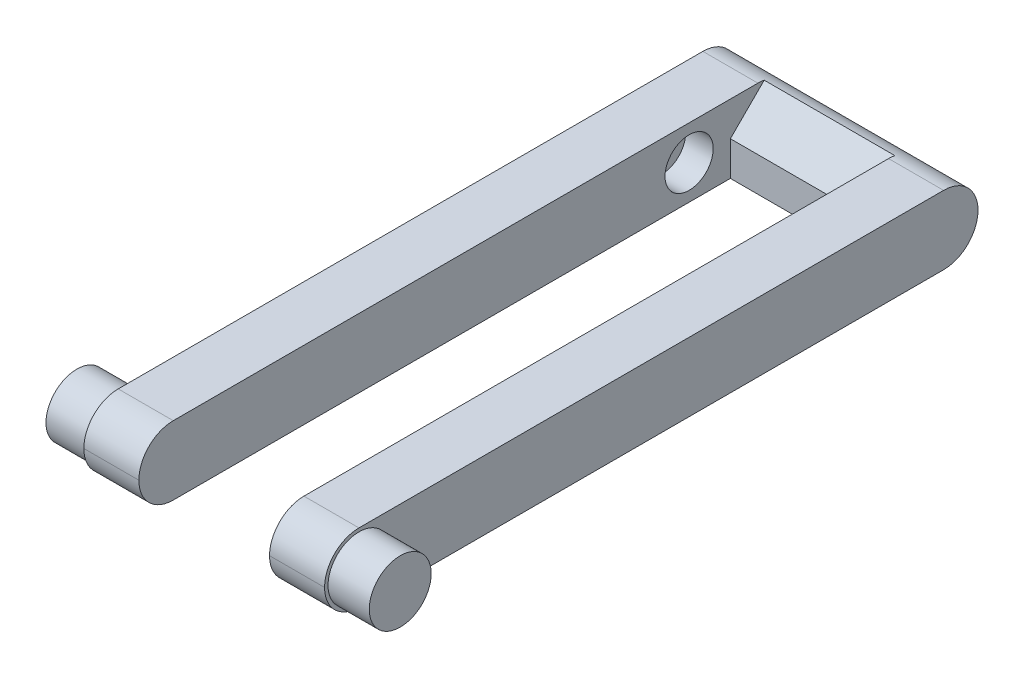
ISO-10303-21;
HEADER;
FILE_DESCRIPTION(('STEP AP214'),'2;1');
FILE_NAME('part.step','',(''),(''),'','','');
FILE_SCHEMA(('AUTOMOTIVE_DESIGN { 1 0 10303 214 1 1 1 1 }'));
ENDSEC;
DATA;
#1=APPLICATION_CONTEXT('core data for automotive mechanical design processes');
#2=APPLICATION_PROTOCOL_DEFINITION('international standard','automotive_design',2000,#1);
#3=PRODUCT_CONTEXT('',#1,'mechanical');
#4=PRODUCT('Part','Part','',(#3));
#5=PRODUCT_RELATED_PRODUCT_CATEGORY('part','',(#4));
#6=PRODUCT_DEFINITION_FORMATION('','',#4);
#7=PRODUCT_DEFINITION_CONTEXT('part definition',#1,'design');
#8=PRODUCT_DEFINITION('design','',#6,#7);
#9=PRODUCT_DEFINITION_SHAPE('','',#8);
#10=(LENGTH_UNIT() NAMED_UNIT(*) SI_UNIT(.MILLI.,.METRE.));
#11=(NAMED_UNIT(*) PLANE_ANGLE_UNIT() SI_UNIT($,.RADIAN.));
#12=(NAMED_UNIT(*) SI_UNIT($,.STERADIAN.) SOLID_ANGLE_UNIT());
#13=UNCERTAINTY_MEASURE_WITH_UNIT(LENGTH_MEASURE(1.E-05),#10,'distance_accuracy_value','');
#14=(GEOMETRIC_REPRESENTATION_CONTEXT(3) GLOBAL_UNCERTAINTY_ASSIGNED_CONTEXT((#13)) GLOBAL_UNIT_ASSIGNED_CONTEXT((#10,
#11,#12)) REPRESENTATION_CONTEXT('',''));
#15=CARTESIAN_POINT('',(0.,0.,0.));
#16=DIRECTION('',(0.,0.,1.));
#17=DIRECTION('',(1.,0.,0.));
#18=AXIS2_PLACEMENT_3D('',#15,#16,#17);
#19=CARTESIAN_POINT('',(0.,5.,0.));
#20=DIRECTION('',(0.,1.,0.));
#21=DIRECTION('',(0.,0.,1.));
#22=AXIS2_PLACEMENT_3D('',#19,#20,#21);
#23=PLANE('',#22);
#24=DIRECTION('',(0.,0.,1.));
#25=VECTOR('',#24,1.);
#26=CARTESIAN_POINT('',(17.5,5.,0.));
#27=LINE('',#26,#25);
#28=CARTESIAN_POINT('',(17.5,5.,2.5));
#29=VERTEX_POINT('',#28);
#30=CARTESIAN_POINT('',(17.5,5.,45.));
#31=VERTEX_POINT('',#30);
#32=EDGE_CURVE('E177',#29,#31,#27,.T.);
#33=ORIENTED_EDGE('',*,*,#32,.F.);
#34=DIRECTION('',(1.,0.,0.));
#35=VECTOR('',#34,1.);
#36=CARTESIAN_POINT('',(0.,5.,2.5));
#37=LINE('',#36,#35);
#38=CARTESIAN_POINT('',(13.5,5.,2.5));
#39=VERTEX_POINT('',#38);
#40=EDGE_CURVE('E263',#29,#39,#37,.F.);
#41=ORIENTED_EDGE('',*,*,#40,.T.);
#42=DIRECTION('',(0.,0.,-1.));
#43=VECTOR('',#42,1.);
#44=CARTESIAN_POINT('',(13.5,5.,0.));
#45=LINE('',#44,#43);
#46=CARTESIAN_POINT('',(13.5,5.,45.));
#47=VERTEX_POINT('',#46);
#48=EDGE_CURVE('E174',#47,#39,#45,.T.);
#49=ORIENTED_EDGE('',*,*,#48,.F.);
#50=DIRECTION('',(1.,0.,0.));
#51=VECTOR('',#50,1.);
#52=CARTESIAN_POINT('',(17.5,5.,45.));
#53=LINE('',#52,#51);
#54=EDGE_CURVE('E199',#47,#31,#53,.T.);
#55=ORIENTED_EDGE('',*,*,#54,.T.);
#56=EDGE_LOOP('',(#33,#41,#49,#55));
#57=FACE_BOUND('',#56,.T.);
#58=ADVANCED_FACE('F45',(#57),#23,.T.);
#59=CARTESIAN_POINT('',(0.,5.,2.));
#60=DIRECTION('',(0.,0.707106781186548,0.707106781186548));
#61=DIRECTION('',(-1.,0.,0.));
#62=AXIS2_PLACEMENT_3D('',#59,#60,#61);
#63=PLANE('',#62);
#64=DIRECTION('',(0.,-0.707106781186548,0.707106781186548));
#65=VECTOR('',#64,1.);
#66=CARTESIAN_POINT('',(13.5,5.,2.));
#67=LINE('',#66,#65);
#68=CARTESIAN_POINT('',(13.5,2.5,4.5));
#69=VERTEX_POINT('',#68);
#70=CARTESIAN_POINT('',(13.5,4.95773797371133,2.04226202628867));
#71=VERTEX_POINT('',#70);
#72=EDGE_CURVE('E241',#69,#71,#67,.F.);
#73=ORIENTED_EDGE('',*,*,#72,.T.);
#74=DIRECTION('',(1.,0.,0.));
#75=VECTOR('',#74,1.);
#76=CARTESIAN_POINT('',(13.5,4.95773797371133,2.04226202628867));
#77=LINE('',#76,#75);
#78=CARTESIAN_POINT('',(4.00000000000001,4.95773797371133,2.04226202628867));
#79=VERTEX_POINT('',#78);
#80=EDGE_CURVE('E55',#71,#79,#77,.F.);
#81=ORIENTED_EDGE('',*,*,#80,.T.);
#82=DIRECTION('',(0.,0.707106781186548,-0.707106781186548));
#83=VECTOR('',#82,1.);
#84=CARTESIAN_POINT('',(4.00000000000001,6.,1.));
#85=LINE('',#84,#83);
#86=CARTESIAN_POINT('',(4.00000000000001,2.5,4.5));
#87=VERTEX_POINT('',#86);
#88=EDGE_CURVE('E238',#79,#87,#85,.F.);
#89=ORIENTED_EDGE('',*,*,#88,.T.);
#90=DIRECTION('',(-1.,0.,0.));
#91=VECTOR('',#90,1.);
#92=CARTESIAN_POINT('',(0.,2.5,4.5));
#93=LINE('',#92,#91);
#94=EDGE_CURVE('E150',#69,#87,#93,.T.);
#95=ORIENTED_EDGE('',*,*,#94,.F.);
#96=EDGE_LOOP('',(#73,#81,#89,#95));
#97=FACE_BOUND('',#96,.T.);
#98=ADVANCED_FACE('F341',(#97),#63,.T.);
#99=CARTESIAN_POINT('',(13.5,5.,0.));
#100=DIRECTION('',(-1.,0.,0.));
#101=DIRECTION('',(0.,0.,1.));
#102=AXIS2_PLACEMENT_3D('',#99,#100,#101);
#103=PLANE('',#102);
#104=CARTESIAN_POINT('',(13.5,2.5,7.5));
#105=DIRECTION('',(-1.,0.,0.));
#106=DIRECTION('',(0.,0.,1.));
#107=AXIS2_PLACEMENT_3D('',#104,#105,#106);
#108=CIRCLE('',#107,1.75);
#109=CARTESIAN_POINT('',(13.5,2.5,9.25));
#110=VERTEX_POINT('',#109);
#111=EDGE_CURVE('E271',#110,#110,#108,.F.);
#112=ORIENTED_EDGE('',*,*,#111,.T.);
#113=EDGE_LOOP('',(#112));
#114=FACE_BOUND('',#113,.T.);
#115=ORIENTED_EDGE('',*,*,#48,.T.);
#116=CARTESIAN_POINT('',(13.5,2.5,2.5));
#117=DIRECTION('',(-1.,0.,0.));
#118=DIRECTION('',(0.,0.,1.));
#119=AXIS2_PLACEMENT_3D('',#116,#117,#118);
#120=CIRCLE('',#119,2.5);
#121=EDGE_CURVE('E70',#39,#71,#120,.T.);
#122=ORIENTED_EDGE('',*,*,#121,.T.);
#123=ORIENTED_EDGE('',*,*,#72,.F.);
#124=DIRECTION('',(0.,-1.,0.));
#125=VECTOR('',#124,1.);
#126=CARTESIAN_POINT('',(13.5,5.,4.5));
#127=LINE('',#126,#125);
#128=CARTESIAN_POINT('',(13.5,0.,4.5));
#129=VERTEX_POINT('',#128);
#130=EDGE_CURVE('E154',#69,#129,#127,.T.);
#131=ORIENTED_EDGE('',*,*,#130,.T.);
#132=DIRECTION('',(0.,0.,-1.));
#133=VECTOR('',#132,1.);
#134=CARTESIAN_POINT('',(13.5,0.,0.));
#135=LINE('',#134,#133);
#136=CARTESIAN_POINT('',(13.5,0.,45.));
#137=VERTEX_POINT('',#136);
#138=EDGE_CURVE('E172',#137,#129,#135,.T.);
#139=ORIENTED_EDGE('',*,*,#138,.F.);
#140=CARTESIAN_POINT('',(13.5,2.5,45.));
#141=DIRECTION('',(-1.,0.,0.));
#142=DIRECTION('',(0.,0.,1.));
#143=AXIS2_PLACEMENT_3D('',#140,#141,#142);
#144=CIRCLE('',#143,2.5);
#145=CARTESIAN_POINT('',(13.5,2.5,47.5));
#146=VERTEX_POINT('',#145);
#147=EDGE_CURVE('E196',#137,#146,#144,.T.);
#148=ORIENTED_EDGE('',*,*,#147,.T.);
#149=CARTESIAN_POINT('',(13.5,2.5,45.));
#150=DIRECTION('',(-1.,0.,0.));
#151=DIRECTION('',(0.,0.,1.));
#152=AXIS2_PLACEMENT_3D('',#149,#150,#151);
#153=CIRCLE('',#152,2.5);
#154=EDGE_CURVE('E193',#146,#47,#153,.T.);
#155=ORIENTED_EDGE('',*,*,#154,.T.);
#156=EDGE_LOOP('',(#115,#122,#123,#131,#139,#148,#155));
#157=FACE_BOUND('',#156,.T.);
#158=ADVANCED_FACE('F339',(#114,#157),#103,.T.);
#159=CARTESIAN_POINT('',(17.5,5.,0.));
#160=DIRECTION('',(1.,0.,0.));
#161=DIRECTION('',(0.,0.,-1.));
#162=AXIS2_PLACEMENT_3D('',#159,#160,#161);
#163=PLANE('',#162);
#164=CARTESIAN_POINT('',(17.5,2.5,45.));
#165=DIRECTION('',(1.,0.,0.));
#166=DIRECTION('',(0.,0.,-1.));
#167=AXIS2_PLACEMENT_3D('',#164,#165,#166);
#168=CIRCLE('',#167,2.25);
#169=CARTESIAN_POINT('',(17.5,2.5,42.75));
#170=VERTEX_POINT('',#169);
#171=EDGE_CURVE('E208',#170,#170,#168,.T.);
#172=ORIENTED_EDGE('',*,*,#171,.F.);
#173=EDGE_LOOP('',(#172));
#174=FACE_BOUND('',#173,.T.);
#175=DIRECTION('',(0.,0.,1.));
#176=VECTOR('',#175,1.);
#177=CARTESIAN_POINT('',(17.5,0.,0.));
#178=LINE('',#177,#176);
#179=CARTESIAN_POINT('',(17.5,0.,2.5));
#180=VERTEX_POINT('',#179);
#181=CARTESIAN_POINT('',(17.5,0.,45.));
#182=VERTEX_POINT('',#181);
#183=EDGE_CURVE('E306',#180,#182,#178,.T.);
#184=ORIENTED_EDGE('',*,*,#183,.F.);
#185=CARTESIAN_POINT('',(17.5,2.5,2.5));
#186=DIRECTION('',(1.,0.,0.));
#187=DIRECTION('',(0.,0.,-1.));
#188=AXIS2_PLACEMENT_3D('',#185,#186,#187);
#189=CIRCLE('',#188,2.5);
#190=CARTESIAN_POINT('',(17.5,2.5,0.));
#191=VERTEX_POINT('',#190);
#192=EDGE_CURVE('E251',#180,#191,#189,.T.);
#193=ORIENTED_EDGE('',*,*,#192,.T.);
#194=CARTESIAN_POINT('',(17.5,2.5,2.5));
#195=DIRECTION('',(1.,0.,0.));
#196=DIRECTION('',(0.,0.,-1.));
#197=AXIS2_PLACEMENT_3D('',#194,#195,#196);
#198=CIRCLE('',#197,2.5);
#199=EDGE_CURVE('E248',#191,#29,#198,.T.);
#200=ORIENTED_EDGE('',*,*,#199,.T.);
#201=ORIENTED_EDGE('',*,*,#32,.T.);
#202=CARTESIAN_POINT('',(17.5,2.5,45.));
#203=DIRECTION('',(1.,0.,0.));
#204=DIRECTION('',(0.,0.,-1.));
#205=AXIS2_PLACEMENT_3D('',#202,#203,#204);
#206=CIRCLE('',#205,2.5);
#207=CARTESIAN_POINT('',(17.5,2.5,47.5));
#208=VERTEX_POINT('',#207);
#209=EDGE_CURVE('E153',#31,#208,#206,.T.);
#210=ORIENTED_EDGE('',*,*,#209,.T.);
#211=CARTESIAN_POINT('',(17.5,2.5,45.));
#212=DIRECTION('',(1.,0.,0.));
#213=DIRECTION('',(0.,0.,-1.));
#214=AXIS2_PLACEMENT_3D('',#211,#212,#213);
#215=CIRCLE('',#214,2.5);
#216=EDGE_CURVE('E186',#208,#182,#215,.T.);
#217=ORIENTED_EDGE('',*,*,#216,.T.);
#218=EDGE_LOOP('',(#184,#193,#200,#201,#210,#217));
#219=FACE_BOUND('',#218,.T.);
#220=ADVANCED_FACE('F332',(#174,#219),#163,.T.);
#221=CARTESIAN_POINT('',(0.,5.,0.));
#222=DIRECTION('',(1.,0.,0.));
#223=DIRECTION('',(0.,0.,-1.));
#224=AXIS2_PLACEMENT_3D('',#221,#222,#223);
#225=PLANE('',#224);
#226=CARTESIAN_POINT('',(0.,2.5,45.));
#227=DIRECTION('',(1.,0.,0.));
#228=DIRECTION('',(0.,0.,-1.));
#229=AXIS2_PLACEMENT_3D('',#226,#227,#228);
#230=CIRCLE('',#229,2.25);
#231=CARTESIAN_POINT('',(0.,2.5,42.75));
#232=VERTEX_POINT('',#231);
#233=EDGE_CURVE('E203',#232,#232,#230,.F.);
#234=ORIENTED_EDGE('',*,*,#233,.F.);
#235=EDGE_LOOP('',(#234));
#236=FACE_BOUND('',#235,.T.);
#237=CARTESIAN_POINT('',(0.,2.5,2.5));
#238=DIRECTION('',(1.,0.,0.));
#239=DIRECTION('',(0.,0.,-1.));
#240=AXIS2_PLACEMENT_3D('',#237,#238,#239);
#241=CIRCLE('',#240,2.5);
#242=CARTESIAN_POINT('',(0.,5.,2.5));
#243=VERTEX_POINT('',#242);
#244=CARTESIAN_POINT('',(0.,2.5,0.));
#245=VERTEX_POINT('',#244);
#246=EDGE_CURVE('E254',#243,#245,#241,.F.);
#247=ORIENTED_EDGE('',*,*,#246,.T.);
#248=CARTESIAN_POINT('',(0.,2.5,2.5));
#249=DIRECTION('',(1.,0.,0.));
#250=DIRECTION('',(0.,0.,-1.));
#251=AXIS2_PLACEMENT_3D('',#248,#249,#250);
#252=CIRCLE('',#251,2.5);
#253=CARTESIAN_POINT('',(0.,0.,2.5));
#254=VERTEX_POINT('',#253);
#255=EDGE_CURVE('E257',#245,#254,#252,.F.);
#256=ORIENTED_EDGE('',*,*,#255,.T.);
#257=DIRECTION('',(0.,0.,1.));
#258=VECTOR('',#257,1.);
#259=CARTESIAN_POINT('',(0.,0.,0.));
#260=LINE('',#259,#258);
#261=CARTESIAN_POINT('',(0.,0.,45.));
#262=VERTEX_POINT('',#261);
#263=EDGE_CURVE('E165',#254,#262,#260,.T.);
#264=ORIENTED_EDGE('',*,*,#263,.T.);
#265=CARTESIAN_POINT('',(0.,2.5,45.));
#266=DIRECTION('',(1.,0.,0.));
#267=DIRECTION('',(0.,0.,-1.));
#268=AXIS2_PLACEMENT_3D('',#265,#266,#267);
#269=CIRCLE('',#268,2.5);
#270=CARTESIAN_POINT('',(0.,2.5,47.5));
#271=VERTEX_POINT('',#270);
#272=EDGE_CURVE('E225',#262,#271,#269,.F.);
#273=ORIENTED_EDGE('',*,*,#272,.T.);
#274=CARTESIAN_POINT('',(0.,2.5,45.));
#275=DIRECTION('',(1.,0.,0.));
#276=DIRECTION('',(0.,0.,-1.));
#277=AXIS2_PLACEMENT_3D('',#274,#275,#276);
#278=CIRCLE('',#277,2.5);
#279=CARTESIAN_POINT('',(0.,5.,45.));
#280=VERTEX_POINT('',#279);
#281=EDGE_CURVE('E221',#271,#280,#278,.F.);
#282=ORIENTED_EDGE('',*,*,#281,.T.);
#283=DIRECTION('',(0.,0.,1.));
#284=VECTOR('',#283,1.);
#285=CARTESIAN_POINT('',(0.,5.,0.));
#286=LINE('',#285,#284);
#287=EDGE_CURVE('E298',#243,#280,#286,.T.);
#288=ORIENTED_EDGE('',*,*,#287,.F.);
#289=EDGE_LOOP('',(#247,#256,#264,#273,#282,#288));
#290=FACE_BOUND('',#289,.T.);
#291=ADVANCED_FACE('F311',(#236,#290),#225,.F.);
#292=CARTESIAN_POINT('',(4.00000000000001,5.,0.));
#293=DIRECTION('',(-1.,0.,0.));
#294=DIRECTION('',(0.,0.,1.));
#295=AXIS2_PLACEMENT_3D('',#292,#293,#294);
#296=PLANE('',#295);
#297=CARTESIAN_POINT('',(4.00000000000001,2.5,7.5));
#298=DIRECTION('',(-1.,0.,0.));
#299=DIRECTION('',(0.,0.,1.));
#300=AXIS2_PLACEMENT_3D('',#297,#298,#299);
#301=CIRCLE('',#300,1.75);
#302=CARTESIAN_POINT('',(4.00000000000001,2.5,9.25));
#303=VERTEX_POINT('',#302);
#304=EDGE_CURVE('E49',#303,#303,#301,.F.);
#305=ORIENTED_EDGE('',*,*,#304,.F.);
#306=EDGE_LOOP('',(#305));
#307=FACE_BOUND('',#306,.T.);
#308=ORIENTED_EDGE('',*,*,#88,.F.);
#309=CARTESIAN_POINT('',(4.00000000000001,2.5,2.5));
#310=DIRECTION('',(-1.,0.,0.));
#311=DIRECTION('',(0.,0.,1.));
#312=AXIS2_PLACEMENT_3D('',#309,#310,#311);
#313=CIRCLE('',#312,2.5);
#314=CARTESIAN_POINT('',(4.00000000000001,5.,2.5));
#315=VERTEX_POINT('',#314);
#316=EDGE_CURVE('E13',#79,#315,#313,.F.);
#317=ORIENTED_EDGE('',*,*,#316,.T.);
#318=DIRECTION('',(0.,0.,-1.));
#319=VECTOR('',#318,1.);
#320=CARTESIAN_POINT('',(4.00000000000001,5.,0.));
#321=LINE('',#320,#319);
#322=CARTESIAN_POINT('',(4.00000000000001,5.,45.));
#323=VERTEX_POINT('',#322);
#324=EDGE_CURVE('E182',#323,#315,#321,.T.);
#325=ORIENTED_EDGE('',*,*,#324,.F.);
#326=CARTESIAN_POINT('',(4.00000000000001,2.5,45.));
#327=DIRECTION('',(-1.,0.,0.));
#328=DIRECTION('',(0.,0.,1.));
#329=AXIS2_PLACEMENT_3D('',#326,#327,#328);
#330=CIRCLE('',#329,2.5);
#331=CARTESIAN_POINT('',(4.00000000000001,2.5,47.5));
#332=VERTEX_POINT('',#331);
#333=EDGE_CURVE('E213',#323,#332,#330,.F.);
#334=ORIENTED_EDGE('',*,*,#333,.T.);
#335=CARTESIAN_POINT('',(4.00000000000001,2.5,45.));
#336=DIRECTION('',(-1.,0.,0.));
#337=DIRECTION('',(0.,0.,1.));
#338=AXIS2_PLACEMENT_3D('',#335,#336,#337);
#339=CIRCLE('',#338,2.5);
#340=CARTESIAN_POINT('',(4.00000000000001,0.,45.));
#341=VERTEX_POINT('',#340);
#342=EDGE_CURVE('E160',#332,#341,#339,.F.);
#343=ORIENTED_EDGE('',*,*,#342,.T.);
#344=DIRECTION('',(0.,0.,-1.));
#345=VECTOR('',#344,1.);
#346=CARTESIAN_POINT('',(4.00000000000001,0.,0.));
#347=LINE('',#346,#345);
#348=CARTESIAN_POINT('',(4.00000000000001,0.,4.5));
#349=VERTEX_POINT('',#348);
#350=EDGE_CURVE('E157',#341,#349,#347,.T.);
#351=ORIENTED_EDGE('',*,*,#350,.T.);
#352=DIRECTION('',(0.,-1.,0.));
#353=VECTOR('',#352,1.);
#354=CARTESIAN_POINT('',(4.00000000000001,5.,4.5));
#355=LINE('',#354,#353);
#356=EDGE_CURVE('E143',#87,#349,#355,.T.);
#357=ORIENTED_EDGE('',*,*,#356,.F.);
#358=EDGE_LOOP('',(#308,#317,#325,#334,#343,#351,#357));
#359=FACE_BOUND('',#358,.T.);
#360=ADVANCED_FACE('F158',(#307,#359),#296,.F.);
#361=CARTESIAN_POINT('',(0.,5.,4.5));
#362=DIRECTION('',(0.,0.,-1.));
#363=DIRECTION('',(-1.,0.,0.));
#364=AXIS2_PLACEMENT_3D('',#361,#362,#363);
#365=PLANE('',#364);
#366=ORIENTED_EDGE('',*,*,#130,.F.);
#367=ORIENTED_EDGE('',*,*,#94,.T.);
#368=ORIENTED_EDGE('',*,*,#356,.T.);
#369=DIRECTION('',(1.,0.,0.));
#370=VECTOR('',#369,1.);
#371=CARTESIAN_POINT('',(0.,0.,4.5));
#372=LINE('',#371,#370);
#373=EDGE_CURVE('E148',#349,#129,#372,.T.);
#374=ORIENTED_EDGE('',*,*,#373,.T.);
#375=EDGE_LOOP('',(#366,#367,#368,#374));
#376=FACE_BOUND('',#375,.T.);
#377=ADVANCED_FACE('F146',(#376),#365,.F.);
#378=ORIENTED_EDGE('',*,*,#324,.T.);
#379=DIRECTION('',(1.,0.,0.));
#380=VECTOR('',#379,1.);
#381=CARTESIAN_POINT('',(0.,5.,2.5));
#382=LINE('',#381,#380);
#383=EDGE_CURVE('E260',#315,#243,#382,.F.);
#384=ORIENTED_EDGE('',*,*,#383,.T.);
#385=ORIENTED_EDGE('',*,*,#287,.T.);
#386=DIRECTION('',(1.,0.,0.));
#387=VECTOR('',#386,1.);
#388=CARTESIAN_POINT('',(4.00000000000001,5.,45.));
#389=LINE('',#388,#387);
#390=EDGE_CURVE('E228',#280,#323,#389,.T.);
#391=ORIENTED_EDGE('',*,*,#390,.T.);
#392=EDGE_LOOP('',(#378,#384,#385,#391));
#393=FACE_BOUND('',#392,.T.);
#394=ADVANCED_FACE('F364',(#393),#23,.T.);
#395=CARTESIAN_POINT('',(0.,0.,0.));
#396=DIRECTION('',(0.,1.,0.));
#397=DIRECTION('',(0.,0.,1.));
#398=AXIS2_PLACEMENT_3D('',#395,#396,#397);
#399=PLANE('',#398);
#400=ORIENTED_EDGE('',*,*,#263,.F.);
#401=DIRECTION('',(1.,0.,0.));
#402=VECTOR('',#401,1.);
#403=CARTESIAN_POINT('',(17.5,0.,2.5));
#404=LINE('',#403,#402);
#405=EDGE_CURVE('E244',#254,#180,#404,.T.);
#406=ORIENTED_EDGE('',*,*,#405,.T.);
#407=ORIENTED_EDGE('',*,*,#183,.T.);
#408=DIRECTION('',(1.,0.,0.));
#409=VECTOR('',#408,1.);
#410=CARTESIAN_POINT('',(0.,0.,45.));
#411=LINE('',#410,#409);
#412=EDGE_CURVE('E190',#182,#137,#411,.F.);
#413=ORIENTED_EDGE('',*,*,#412,.T.);
#414=ORIENTED_EDGE('',*,*,#138,.T.);
#415=ORIENTED_EDGE('',*,*,#373,.F.);
#416=ORIENTED_EDGE('',*,*,#350,.F.);
#417=DIRECTION('',(1.,0.,0.));
#418=VECTOR('',#417,1.);
#419=CARTESIAN_POINT('',(0.,0.,45.));
#420=LINE('',#419,#418);
#421=EDGE_CURVE('E218',#341,#262,#420,.F.);
#422=ORIENTED_EDGE('',*,*,#421,.T.);
#423=EDGE_LOOP('',(#400,#406,#407,#413,#414,#415,#416,#422));
#424=FACE_BOUND('',#423,.T.);
#425=ADVANCED_FACE('F169',(#424),#399,.F.);
#426=CARTESIAN_POINT('',(20.5,2.5,45.));
#427=DIRECTION('',(-1.,0.,0.));
#428=DIRECTION('',(0.,0.,1.));
#429=AXIS2_PLACEMENT_3D('',#426,#427,#428);
#430=CYLINDRICAL_SURFACE('',#429,2.25);
#431=CARTESIAN_POINT('',(20.5,2.5,45.));
#432=DIRECTION('',(1.,0.,0.));
#433=DIRECTION('',(0.,0.,-1.));
#434=AXIS2_PLACEMENT_3D('',#431,#432,#433);
#435=CIRCLE('',#434,2.25);
#436=CARTESIAN_POINT('',(20.5,2.5,42.75));
#437=VERTEX_POINT('',#436);
#438=EDGE_CURVE('E289',#437,#437,#435,.T.);
#439=ORIENTED_EDGE('',*,*,#438,.F.);
#440=EDGE_LOOP('',(#439));
#441=FACE_BOUND('',#440,.T.);
#442=ORIENTED_EDGE('',*,*,#171,.T.);
#443=EDGE_LOOP('',(#442));
#444=FACE_BOUND('',#443,.T.);
#445=ADVANCED_FACE('F358',(#441,#444),#430,.T.);
#446=CARTESIAN_POINT('',(20.5,2.5,45.));
#447=DIRECTION('',(1.,0.,0.));
#448=DIRECTION('',(0.,0.,-1.));
#449=AXIS2_PLACEMENT_3D('',#446,#447,#448);
#450=PLANE('',#449);
#451=ORIENTED_EDGE('',*,*,#438,.T.);
#452=EDGE_LOOP('',(#451));
#453=FACE_BOUND('',#452,.T.);
#454=ADVANCED_FACE('F350',(#453),#450,.T.);
#455=CARTESIAN_POINT('',(0.,2.5,45.));
#456=DIRECTION('',(-1.,0.,0.));
#457=DIRECTION('',(0.,0.,1.));
#458=AXIS2_PLACEMENT_3D('',#455,#456,#457);
#459=CYLINDRICAL_SURFACE('',#458,2.5);
#460=ORIENTED_EDGE('',*,*,#54,.F.);
#461=ORIENTED_EDGE('',*,*,#154,.F.);
#462=DIRECTION('',(1.,0.,0.));
#463=VECTOR('',#462,1.);
#464=CARTESIAN_POINT('',(13.5,2.5,47.5));
#465=LINE('',#464,#463);
#466=EDGE_CURVE('E204',#208,#146,#465,.F.);
#467=ORIENTED_EDGE('',*,*,#466,.F.);
#468=ORIENTED_EDGE('',*,*,#209,.F.);
#469=EDGE_LOOP('',(#460,#461,#467,#468));
#470=FACE_BOUND('',#469,.T.);
#471=ADVANCED_FACE('F348',(#470),#459,.T.);
#472=CARTESIAN_POINT('',(0.,2.5,45.));
#473=DIRECTION('',(1.,0.,0.));
#474=DIRECTION('',(0.,0.,-1.));
#475=AXIS2_PLACEMENT_3D('',#472,#473,#474);
#476=CYLINDRICAL_SURFACE('',#475,2.5);
#477=ORIENTED_EDGE('',*,*,#147,.F.);
#478=ORIENTED_EDGE('',*,*,#412,.F.);
#479=ORIENTED_EDGE('',*,*,#216,.F.);
#480=ORIENTED_EDGE('',*,*,#466,.T.);
#481=EDGE_LOOP('',(#477,#478,#479,#480));
#482=FACE_BOUND('',#481,.T.);
#483=ADVANCED_FACE('F338',(#482),#476,.T.);
#484=CARTESIAN_POINT('',(-2.99999999999999,2.5,45.));
#485=DIRECTION('',(1.,0.,0.));
#486=DIRECTION('',(0.,0.,-1.));
#487=AXIS2_PLACEMENT_3D('',#484,#485,#486);
#488=CYLINDRICAL_SURFACE('',#487,2.25);
#489=CARTESIAN_POINT('',(-2.99999999999999,2.5,45.));
#490=DIRECTION('',(-1.,0.,0.));
#491=DIRECTION('',(0.,0.,1.));
#492=AXIS2_PLACEMENT_3D('',#489,#490,#491);
#493=CIRCLE('',#492,2.25);
#494=CARTESIAN_POINT('',(-2.99999999999999,2.5,47.25));
#495=VERTEX_POINT('',#494);
#496=EDGE_CURVE('E209',#495,#495,#493,.T.);
#497=ORIENTED_EDGE('',*,*,#496,.F.);
#498=EDGE_LOOP('',(#497));
#499=FACE_BOUND('',#498,.T.);
#500=ORIENTED_EDGE('',*,*,#233,.T.);
#501=EDGE_LOOP('',(#500));
#502=FACE_BOUND('',#501,.T.);
#503=ADVANCED_FACE('F356',(#499,#502),#488,.T.);
#504=CARTESIAN_POINT('',(-2.99999999999999,2.5,45.));
#505=DIRECTION('',(-1.,0.,0.));
#506=DIRECTION('',(0.,0.,1.));
#507=AXIS2_PLACEMENT_3D('',#504,#505,#506);
#508=PLANE('',#507);
#509=ORIENTED_EDGE('',*,*,#496,.T.);
#510=EDGE_LOOP('',(#509));
#511=FACE_BOUND('',#510,.T.);
#512=ADVANCED_FACE('F455',(#511),#508,.T.);
#513=CARTESIAN_POINT('',(0.,2.5,45.));
#514=DIRECTION('',(-1.,0.,0.));
#515=DIRECTION('',(0.,0.,1.));
#516=AXIS2_PLACEMENT_3D('',#513,#514,#515);
#517=CYLINDRICAL_SURFACE('',#516,2.5);
#518=ORIENTED_EDGE('',*,*,#390,.F.);
#519=ORIENTED_EDGE('',*,*,#281,.F.);
#520=DIRECTION('',(1.,0.,0.));
#521=VECTOR('',#520,1.);
#522=CARTESIAN_POINT('',(0.,2.5,47.5));
#523=LINE('',#522,#521);
#524=EDGE_CURVE('E231',#332,#271,#523,.F.);
#525=ORIENTED_EDGE('',*,*,#524,.F.);
#526=ORIENTED_EDGE('',*,*,#333,.F.);
#527=EDGE_LOOP('',(#518,#519,#525,#526));
#528=FACE_BOUND('',#527,.T.);
#529=ADVANCED_FACE('F320',(#528),#517,.T.);
#530=CARTESIAN_POINT('',(0.,2.5,45.));
#531=DIRECTION('',(1.,0.,0.));
#532=DIRECTION('',(0.,0.,-1.));
#533=AXIS2_PLACEMENT_3D('',#530,#531,#532);
#534=CYLINDRICAL_SURFACE('',#533,2.5);
#535=ORIENTED_EDGE('',*,*,#272,.F.);
#536=ORIENTED_EDGE('',*,*,#421,.F.);
#537=ORIENTED_EDGE('',*,*,#342,.F.);
#538=ORIENTED_EDGE('',*,*,#524,.T.);
#539=EDGE_LOOP('',(#535,#536,#537,#538));
#540=FACE_BOUND('',#539,.T.);
#541=ADVANCED_FACE('F315',(#540),#534,.T.);
#542=CARTESIAN_POINT('',(0.,2.5,2.5));
#543=DIRECTION('',(1.,0.,0.));
#544=DIRECTION('',(0.,0.,-1.));
#545=AXIS2_PLACEMENT_3D('',#542,#543,#544);
#546=CYLINDRICAL_SURFACE('',#545,2.5);
#547=DIRECTION('',(1.,0.,0.));
#548=VECTOR('',#547,1.);
#549=CARTESIAN_POINT('',(0.,2.5,0.));
#550=LINE('',#549,#548);
#551=EDGE_CURVE('E235',#245,#191,#550,.T.);
#552=ORIENTED_EDGE('',*,*,#551,.F.);
#553=ORIENTED_EDGE('',*,*,#246,.F.);
#554=ORIENTED_EDGE('',*,*,#383,.F.);
#555=ORIENTED_EDGE('',*,*,#316,.F.);
#556=ORIENTED_EDGE('',*,*,#80,.F.);
#557=ORIENTED_EDGE('',*,*,#121,.F.);
#558=ORIENTED_EDGE('',*,*,#40,.F.);
#559=ORIENTED_EDGE('',*,*,#199,.F.);
#560=EDGE_LOOP('',(#552,#553,#554,#555,#556,#557,#558,#559));
#561=FACE_BOUND('',#560,.T.);
#562=ADVANCED_FACE('F47',(#561),#546,.T.);
#563=CARTESIAN_POINT('',(0.,2.5,2.5));
#564=DIRECTION('',(-1.,0.,0.));
#565=DIRECTION('',(0.,0.,1.));
#566=AXIS2_PLACEMENT_3D('',#563,#564,#565);
#567=CYLINDRICAL_SURFACE('',#566,2.5);
#568=ORIENTED_EDGE('',*,*,#255,.F.);
#569=ORIENTED_EDGE('',*,*,#551,.T.);
#570=ORIENTED_EDGE('',*,*,#192,.F.);
#571=ORIENTED_EDGE('',*,*,#405,.F.);
#572=EDGE_LOOP('',(#568,#569,#570,#571));
#573=FACE_BOUND('',#572,.T.);
#574=ADVANCED_FACE('F329',(#573),#567,.T.);
#575=CARTESIAN_POINT('',(2.00000000000001,2.5,7.5));
#576=DIRECTION('',(-1.,0.,0.));
#577=DIRECTION('',(0.,0.,1.));
#578=AXIS2_PLACEMENT_3D('',#575,#576,#577);
#579=PLANE('',#578);
#580=CARTESIAN_POINT('',(2.00000000000001,2.5,7.5));
#581=DIRECTION('',(-1.,0.,0.));
#582=DIRECTION('',(0.,0.,1.));
#583=AXIS2_PLACEMENT_3D('',#580,#581,#582);
#584=CIRCLE('',#583,1.75);
#585=CARTESIAN_POINT('',(2.00000000000001,2.5,9.25));
#586=VERTEX_POINT('',#585);
#587=EDGE_CURVE('E282',#586,#586,#584,.T.);
#588=ORIENTED_EDGE('',*,*,#587,.F.);
#589=EDGE_LOOP('',(#588));
#590=FACE_BOUND('',#589,.T.);
#591=ADVANCED_FACE('F413',(#590),#579,.F.);
#592=CARTESIAN_POINT('',(2.00000000000001,2.5,7.5));
#593=DIRECTION('',(1.,0.,0.));
#594=DIRECTION('',(0.,0.,-1.));
#595=AXIS2_PLACEMENT_3D('',#592,#593,#594);
#596=CYLINDRICAL_SURFACE('',#595,1.75);
#597=ORIENTED_EDGE('',*,*,#587,.T.);
#598=EDGE_LOOP('',(#597));
#599=FACE_BOUND('',#598,.T.);
#600=ORIENTED_EDGE('',*,*,#304,.T.);
#601=EDGE_LOOP('',(#600));
#602=FACE_BOUND('',#601,.T.);
#603=ADVANCED_FACE('F418',(#599,#602),#596,.F.);
#604=ORIENTED_EDGE('',*,*,#111,.F.);
#605=EDGE_LOOP('',(#604));
#606=FACE_BOUND('',#605,.T.);
#607=CARTESIAN_POINT('',(15.5,2.5,7.5));
#608=DIRECTION('',(-1.,0.,0.));
#609=DIRECTION('',(0.,0.,1.));
#610=AXIS2_PLACEMENT_3D('',#607,#608,#609);
#611=CIRCLE('',#610,1.75);
#612=CARTESIAN_POINT('',(15.5,2.5,9.25));
#613=VERTEX_POINT('',#612);
#614=EDGE_CURVE('E551',#613,#613,#611,.T.);
#615=ORIENTED_EDGE('',*,*,#614,.F.);
#616=EDGE_LOOP('',(#615));
#617=FACE_BOUND('',#616,.T.);
#618=ADVANCED_FACE('F430',(#606,#617),#596,.F.);
#619=CARTESIAN_POINT('',(15.5,2.5,7.5));
#620=DIRECTION('',(-1.,0.,0.));
#621=DIRECTION('',(0.,0.,1.));
#622=AXIS2_PLACEMENT_3D('',#619,#620,#621);
#623=PLANE('',#622);
#624=ORIENTED_EDGE('',*,*,#614,.T.);
#625=EDGE_LOOP('',(#624));
#626=FACE_BOUND('',#625,.T.);
#627=ADVANCED_FACE('F440',(#626),#623,.T.);
#628=CLOSED_SHELL('',(#58,#98,#158,#220,#291,#360,#377,#394,#425,#445,#454,#471,#483,#503,#512,
#529,#541,#562,#574,#591,#603,#618,#627));
#629=MANIFOLD_SOLID_BREP('B2',#628);
#630=ADVANCED_BREP_SHAPE_REPRESENTATION('',(#18,#629),#14);
#631=SHAPE_DEFINITION_REPRESENTATION(#9,#630);
ENDSEC;
END-ISO-10303-21;
